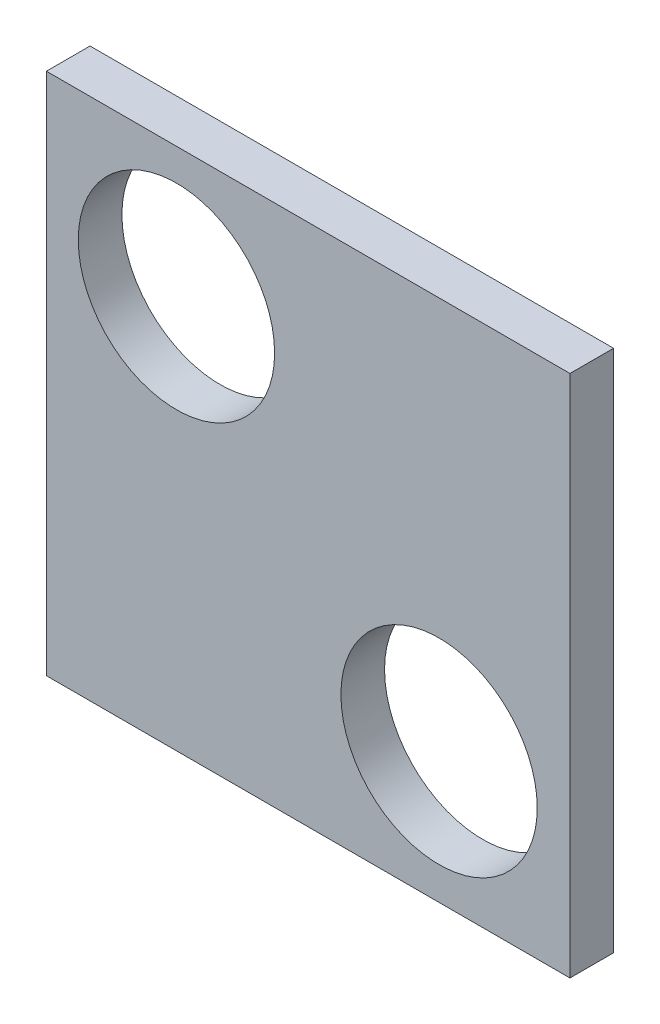
ISO-10303-21;
HEADER;
FILE_DESCRIPTION(('STEP AP214'),'2;1');
FILE_NAME('part.step','',(''),(''),'','','');
FILE_SCHEMA(('AUTOMOTIVE_DESIGN { 1 0 10303 214 1 1 1 1 }'));
ENDSEC;
DATA;
#1=APPLICATION_CONTEXT('core data for automotive mechanical design processes');
#2=APPLICATION_PROTOCOL_DEFINITION('international standard','automotive_design',2000,#1);
#3=PRODUCT_CONTEXT('',#1,'mechanical');
#4=PRODUCT('Part','Part','',(#3));
#5=PRODUCT_RELATED_PRODUCT_CATEGORY('part','',(#4));
#6=PRODUCT_DEFINITION_FORMATION('','',#4);
#7=PRODUCT_DEFINITION_CONTEXT('part definition',#1,'design');
#8=PRODUCT_DEFINITION('design','',#6,#7);
#9=PRODUCT_DEFINITION_SHAPE('','',#8);
#10=(LENGTH_UNIT() NAMED_UNIT(*) SI_UNIT(.MILLI.,.METRE.));
#11=(NAMED_UNIT(*) PLANE_ANGLE_UNIT() SI_UNIT($,.RADIAN.));
#12=(NAMED_UNIT(*) SI_UNIT($,.STERADIAN.) SOLID_ANGLE_UNIT());
#13=UNCERTAINTY_MEASURE_WITH_UNIT(LENGTH_MEASURE(1.E-05),#10,'distance_accuracy_value','');
#14=(GEOMETRIC_REPRESENTATION_CONTEXT(3) GLOBAL_UNCERTAINTY_ASSIGNED_CONTEXT((#13)) GLOBAL_UNIT_ASSIGNED_CONTEXT((#10,
#11,#12)) REPRESENTATION_CONTEXT('',''));
#15=CARTESIAN_POINT('',(0.,0.,0.));
#16=DIRECTION('',(0.,0.,1.));
#17=DIRECTION('',(1.,0.,0.));
#18=AXIS2_PLACEMENT_3D('',#15,#16,#17);
#19=CARTESIAN_POINT('',(0.,0.,0.25));
#20=DIRECTION('',(0.,0.,-1.));
#21=DIRECTION('',(-1.,0.,0.));
#22=AXIS2_PLACEMENT_3D('',#19,#20,#21);
#23=PLANE('',#22);
#24=CARTESIAN_POINT('',(2.25,0.75,0.25));
#25=DIRECTION('',(0.,0.,1.));
#26=DIRECTION('',(1.,0.,0.));
#27=AXIS2_PLACEMENT_3D('',#24,#25,#26);
#28=CIRCLE('',#27,0.5625);
#29=CARTESIAN_POINT('',(2.8125,0.75,0.25));
#30=VERTEX_POINT('',#29);
#31=EDGE_CURVE('E120',#30,#30,#28,.T.);
#32=ORIENTED_EDGE('',*,*,#31,.F.);
#33=EDGE_LOOP('',(#32));
#34=FACE_BOUND('',#33,.T.);
#35=DIRECTION('',(0.,-1.,0.));
#36=VECTOR('',#35,1.);
#37=CARTESIAN_POINT('',(0.,0.,0.25));
#38=LINE('',#37,#36);
#39=CARTESIAN_POINT('',(0.,3.,0.25));
#40=VERTEX_POINT('',#39);
#41=CARTESIAN_POINT('',(0.,0.,0.25));
#42=VERTEX_POINT('',#41);
#43=EDGE_CURVE('E87',#40,#42,#38,.T.);
#44=ORIENTED_EDGE('',*,*,#43,.T.);
#45=DIRECTION('',(1.,0.,0.));
#46=VECTOR('',#45,1.);
#47=CARTESIAN_POINT('',(0.,0.,0.25));
#48=LINE('',#47,#46);
#49=CARTESIAN_POINT('',(3.,0.,0.25));
#50=VERTEX_POINT('',#49);
#51=EDGE_CURVE('E82',#42,#50,#48,.T.);
#52=ORIENTED_EDGE('',*,*,#51,.T.);
#53=DIRECTION('',(0.,1.,0.));
#54=VECTOR('',#53,1.);
#55=CARTESIAN_POINT('',(3.,0.,0.25));
#56=LINE('',#55,#54);
#57=CARTESIAN_POINT('',(3.,3.,0.25));
#58=VERTEX_POINT('',#57);
#59=EDGE_CURVE('E85',#50,#58,#56,.T.);
#60=ORIENTED_EDGE('',*,*,#59,.T.);
#61=DIRECTION('',(-1.,0.,0.));
#62=VECTOR('',#61,1.);
#63=CARTESIAN_POINT('',(0.,3.,0.25));
#64=LINE('',#63,#62);
#65=EDGE_CURVE('E52',#58,#40,#64,.T.);
#66=ORIENTED_EDGE('',*,*,#65,.T.);
#67=EDGE_LOOP('',(#44,#52,#60,#66));
#68=FACE_BOUND('',#67,.T.);
#69=CARTESIAN_POINT('',(0.745068250517862,2.25493174948214,0.25));
#70=DIRECTION('',(0.,0.,1.));
#71=DIRECTION('',(1.,0.,0.));
#72=AXIS2_PLACEMENT_3D('',#69,#70,#71);
#73=CIRCLE('',#72,0.5625);
#74=CARTESIAN_POINT('',(1.30756825051786,2.25493174948214,0.25));
#75=VERTEX_POINT('',#74);
#76=EDGE_CURVE('E102',#75,#75,#73,.T.);
#77=ORIENTED_EDGE('',*,*,#76,.F.);
#78=EDGE_LOOP('',(#77));
#79=FACE_BOUND('',#78,.T.);
#80=ADVANCED_FACE('F35',(#34,#68,#79),#23,.F.);
#81=CARTESIAN_POINT('',(0.,0.,0.));
#82=DIRECTION('',(0.,0.,-1.));
#83=DIRECTION('',(-1.,0.,0.));
#84=AXIS2_PLACEMENT_3D('',#81,#82,#83);
#85=PLANE('',#84);
#86=CARTESIAN_POINT('',(2.25,0.75,0.));
#87=DIRECTION('',(0.,0.,1.));
#88=DIRECTION('',(1.,0.,0.));
#89=AXIS2_PLACEMENT_3D('',#86,#87,#88);
#90=CIRCLE('',#89,0.5625);
#91=CARTESIAN_POINT('',(2.8125,0.75,0.));
#92=VERTEX_POINT('',#91);
#93=EDGE_CURVE('E117',#92,#92,#90,.T.);
#94=ORIENTED_EDGE('',*,*,#93,.T.);
#95=EDGE_LOOP('',(#94));
#96=FACE_BOUND('',#95,.T.);
#97=DIRECTION('',(0.,-1.,0.));
#98=VECTOR('',#97,1.);
#99=CARTESIAN_POINT('',(0.,0.,0.));
#100=LINE('',#99,#98);
#101=CARTESIAN_POINT('',(0.,3.,0.));
#102=VERTEX_POINT('',#101);
#103=CARTESIAN_POINT('',(0.,0.,0.));
#104=VERTEX_POINT('',#103);
#105=EDGE_CURVE('E99',#102,#104,#100,.T.);
#106=ORIENTED_EDGE('',*,*,#105,.F.);
#107=DIRECTION('',(-1.,0.,0.));
#108=VECTOR('',#107,1.);
#109=CARTESIAN_POINT('',(0.,3.,0.));
#110=LINE('',#109,#108);
#111=CARTESIAN_POINT('',(3.,3.,0.));
#112=VERTEX_POINT('',#111);
#113=EDGE_CURVE('E75',#112,#102,#110,.T.);
#114=ORIENTED_EDGE('',*,*,#113,.F.);
#115=DIRECTION('',(0.,1.,0.));
#116=VECTOR('',#115,1.);
#117=CARTESIAN_POINT('',(3.,0.,0.));
#118=LINE('',#117,#116);
#119=CARTESIAN_POINT('',(3.,0.,0.));
#120=VERTEX_POINT('',#119);
#121=EDGE_CURVE('E69',#120,#112,#118,.T.);
#122=ORIENTED_EDGE('',*,*,#121,.F.);
#123=DIRECTION('',(1.,0.,0.));
#124=VECTOR('',#123,1.);
#125=CARTESIAN_POINT('',(0.,0.,0.));
#126=LINE('',#125,#124);
#127=EDGE_CURVE('E91',#104,#120,#126,.T.);
#128=ORIENTED_EDGE('',*,*,#127,.F.);
#129=EDGE_LOOP('',(#106,#114,#122,#128));
#130=FACE_BOUND('',#129,.T.);
#131=CARTESIAN_POINT('',(0.745068250517862,2.25493174948214,0.));
#132=DIRECTION('',(0.,0.,1.));
#133=DIRECTION('',(1.,0.,0.));
#134=AXIS2_PLACEMENT_3D('',#131,#132,#133);
#135=CIRCLE('',#134,0.5625);
#136=CARTESIAN_POINT('',(1.30756825051786,2.25493174948214,0.));
#137=VERTEX_POINT('',#136);
#138=EDGE_CURVE('E114',#137,#137,#135,.T.);
#139=ORIENTED_EDGE('',*,*,#138,.T.);
#140=EDGE_LOOP('',(#139));
#141=FACE_BOUND('',#140,.T.);
#142=ADVANCED_FACE('F110',(#96,#130,#141),#85,.T.);
#143=CARTESIAN_POINT('',(0.,0.,0.25));
#144=DIRECTION('',(1.,0.,0.));
#145=DIRECTION('',(0.,0.,-1.));
#146=AXIS2_PLACEMENT_3D('',#143,#144,#145);
#147=PLANE('',#146);
#148=ORIENTED_EDGE('',*,*,#105,.T.);
#149=DIRECTION('',(0.,0.,-1.));
#150=VECTOR('',#149,1.);
#151=CARTESIAN_POINT('',(0.,0.,0.25));
#152=LINE('',#151,#150);
#153=EDGE_CURVE('E11',#42,#104,#152,.T.);
#154=ORIENTED_EDGE('',*,*,#153,.F.);
#155=ORIENTED_EDGE('',*,*,#43,.F.);
#156=DIRECTION('',(0.,0.,-1.));
#157=VECTOR('',#156,1.);
#158=CARTESIAN_POINT('',(0.,3.,0.25));
#159=LINE('',#158,#157);
#160=EDGE_CURVE('E95',#40,#102,#159,.T.);
#161=ORIENTED_EDGE('',*,*,#160,.T.);
#162=EDGE_LOOP('',(#148,#154,#155,#161));
#163=FACE_BOUND('',#162,.T.);
#164=ADVANCED_FACE('F37',(#163),#147,.F.);
#165=CARTESIAN_POINT('',(0.,0.,0.25));
#166=DIRECTION('',(0.,1.,0.));
#167=DIRECTION('',(0.,0.,1.));
#168=AXIS2_PLACEMENT_3D('',#165,#166,#167);
#169=PLANE('',#168);
#170=ORIENTED_EDGE('',*,*,#127,.T.);
#171=DIRECTION('',(0.,0.,-1.));
#172=VECTOR('',#171,1.);
#173=CARTESIAN_POINT('',(3.,0.,0.25));
#174=LINE('',#173,#172);
#175=EDGE_CURVE('E44',#50,#120,#174,.T.);
#176=ORIENTED_EDGE('',*,*,#175,.F.);
#177=ORIENTED_EDGE('',*,*,#51,.F.);
#178=ORIENTED_EDGE('',*,*,#153,.T.);
#179=EDGE_LOOP('',(#170,#176,#177,#178));
#180=FACE_BOUND('',#179,.T.);
#181=ADVANCED_FACE('F90',(#180),#169,.F.);
#182=CARTESIAN_POINT('',(3.,0.,0.25));
#183=DIRECTION('',(-1.,0.,0.));
#184=DIRECTION('',(0.,0.,1.));
#185=AXIS2_PLACEMENT_3D('',#182,#183,#184);
#186=PLANE('',#185);
#187=ORIENTED_EDGE('',*,*,#121,.T.);
#188=DIRECTION('',(0.,0.,-1.));
#189=VECTOR('',#188,1.);
#190=CARTESIAN_POINT('',(3.,3.,0.25));
#191=LINE('',#190,#189);
#192=EDGE_CURVE('E92',#58,#112,#191,.T.);
#193=ORIENTED_EDGE('',*,*,#192,.F.);
#194=ORIENTED_EDGE('',*,*,#59,.F.);
#195=ORIENTED_EDGE('',*,*,#175,.T.);
#196=EDGE_LOOP('',(#187,#193,#194,#195));
#197=FACE_BOUND('',#196,.T.);
#198=ADVANCED_FACE('F93',(#197),#186,.F.);
#199=CARTESIAN_POINT('',(0.,3.,0.25));
#200=DIRECTION('',(0.,-1.,0.));
#201=DIRECTION('',(0.,0.,-1.));
#202=AXIS2_PLACEMENT_3D('',#199,#200,#201);
#203=PLANE('',#202);
#204=ORIENTED_EDGE('',*,*,#113,.T.);
#205=ORIENTED_EDGE('',*,*,#160,.F.);
#206=ORIENTED_EDGE('',*,*,#65,.F.);
#207=ORIENTED_EDGE('',*,*,#192,.T.);
#208=EDGE_LOOP('',(#204,#205,#206,#207));
#209=FACE_BOUND('',#208,.T.);
#210=ADVANCED_FACE('F107',(#209),#203,.F.);
#211=CARTESIAN_POINT('',(0.745068250517862,2.25493174948214,0.25));
#212=DIRECTION('',(0.,0.,-1.));
#213=DIRECTION('',(-1.,0.,0.));
#214=AXIS2_PLACEMENT_3D('',#211,#212,#213);
#215=CYLINDRICAL_SURFACE('',#214,0.5625);
#216=ORIENTED_EDGE('',*,*,#76,.T.);
#217=EDGE_LOOP('',(#216));
#218=FACE_BOUND('',#217,.T.);
#219=ORIENTED_EDGE('',*,*,#138,.F.);
#220=EDGE_LOOP('',(#219));
#221=FACE_BOUND('',#220,.T.);
#222=ADVANCED_FACE('F130',(#218,#221),#215,.F.);
#223=CARTESIAN_POINT('',(2.25,0.75,0.));
#224=DIRECTION('',(0.,0.,1.));
#225=DIRECTION('',(1.,0.,0.));
#226=AXIS2_PLACEMENT_3D('',#223,#224,#225);
#227=CYLINDRICAL_SURFACE('',#226,0.5625);
#228=ORIENTED_EDGE('',*,*,#93,.F.);
#229=EDGE_LOOP('',(#228));
#230=FACE_BOUND('',#229,.T.);
#231=ORIENTED_EDGE('',*,*,#31,.T.);
#232=EDGE_LOOP('',(#231));
#233=FACE_BOUND('',#232,.T.);
#234=ADVANCED_FACE('F127',(#230,#233),#227,.F.);
#235=CLOSED_SHELL('',(#80,#142,#164,#181,#198,#210,#222,#234));
#236=MANIFOLD_SOLID_BREP('B2',#235);
#237=ADVANCED_BREP_SHAPE_REPRESENTATION('',(#18,#236),#14);
#238=SHAPE_DEFINITION_REPRESENTATION(#9,#237);
ENDSEC;
END-ISO-10303-21;
